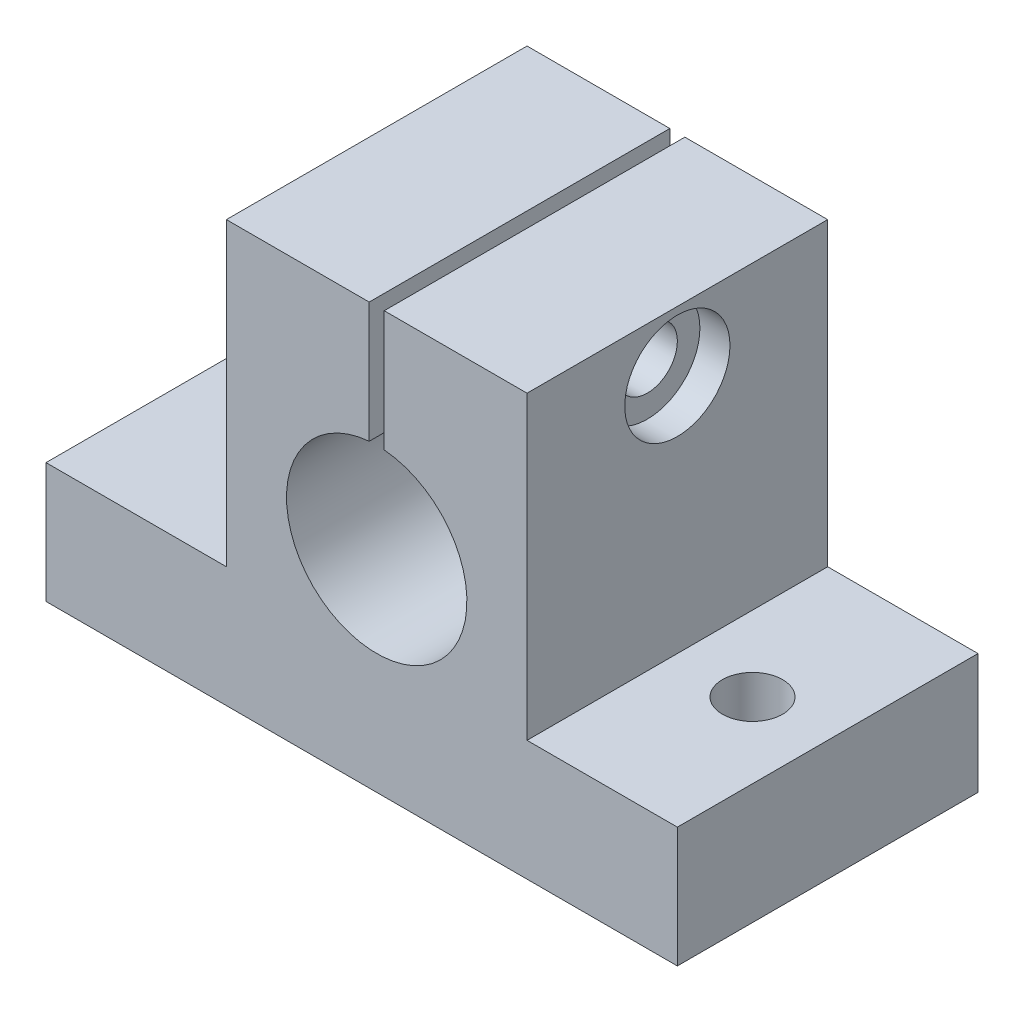
ISO-10303-21;
HEADER;
FILE_DESCRIPTION(('STEP AP214'),'2;1');
FILE_NAME('part.step','',(''),(''),'','','');
FILE_SCHEMA(('AUTOMOTIVE_DESIGN { 1 0 10303 214 1 1 1 1 }'));
ENDSEC;
DATA;
#1=APPLICATION_CONTEXT('core data for automotive mechanical design processes');
#2=APPLICATION_PROTOCOL_DEFINITION('international standard','automotive_design',2000,#1);
#3=PRODUCT_CONTEXT('',#1,'mechanical');
#4=PRODUCT('Part','Part','',(#3));
#5=PRODUCT_RELATED_PRODUCT_CATEGORY('part','',(#4));
#6=PRODUCT_DEFINITION_FORMATION('','',#4);
#7=PRODUCT_DEFINITION_CONTEXT('part definition',#1,'design');
#8=PRODUCT_DEFINITION('design','',#6,#7);
#9=PRODUCT_DEFINITION_SHAPE('','',#8);
#10=(LENGTH_UNIT() NAMED_UNIT(*) SI_UNIT(.MILLI.,.METRE.));
#11=(NAMED_UNIT(*) PLANE_ANGLE_UNIT() SI_UNIT($,.RADIAN.));
#12=(NAMED_UNIT(*) SI_UNIT($,.STERADIAN.) SOLID_ANGLE_UNIT());
#13=UNCERTAINTY_MEASURE_WITH_UNIT(LENGTH_MEASURE(1.E-05),#10,'distance_accuracy_value','');
#14=(GEOMETRIC_REPRESENTATION_CONTEXT(3) GLOBAL_UNCERTAINTY_ASSIGNED_CONTEXT((#13)) GLOBAL_UNIT_ASSIGNED_CONTEXT((#10,
#11,#12)) REPRESENTATION_CONTEXT('',''));
#15=CARTESIAN_POINT('',(0.,0.,0.));
#16=DIRECTION('',(0.,0.,1.));
#17=DIRECTION('',(1.,0.,0.));
#18=AXIS2_PLACEMENT_3D('',#15,#16,#17);
#19=CARTESIAN_POINT('',(-15.6568542494924,24.,10.));
#20=DIRECTION('',(1.,0.,0.));
#21=DIRECTION('',(0.,0.,-1.));
#22=AXIS2_PLACEMENT_3D('',#19,#20,#21);
#23=CYLINDRICAL_SURFACE('',#22,2.);
#24=CARTESIAN_POINT('',(-0.500000000000002,24.,10.));
#25=DIRECTION('',(-1.,0.,0.));
#26=DIRECTION('',(0.,-1.,0.));
#27=AXIS2_PLACEMENT_3D('',#24,#25,#26);
#28=CIRCLE('',#27,2.);
#29=CARTESIAN_POINT('',(-0.500000000000002,24.,8.));
#30=VERTEX_POINT('',#29);
#31=EDGE_CURVE('E219',#30,#30,#28,.T.);
#32=CARTESIAN_POINT('',(-7.,24.,10.));
#33=DIRECTION('',(-1.,0.,0.));
#34=DIRECTION('',(0.,0.,1.));
#35=AXIS2_PLACEMENT_3D('',#32,#33,#34);
#36=CIRCLE('',#35,2.);
#37=CARTESIAN_POINT('',(-7.,24.,8.));
#38=VERTEX_POINT('',#37);
#39=EDGE_CURVE('E39',#38,#38,#36,.F.);
#40=CARTESIAN_POINT('',(-0.500000000000002,24.,8.));
#41=CARTESIAN_POINT('',(-0.567708333333336,24.,8.));
#42=CARTESIAN_POINT('',(-0.635416666666669,24.,8.));
#43=CARTESIAN_POINT('',(-0.770833333333336,24.,8.));
#44=CARTESIAN_POINT('',(-0.838541666666669,24.,8.));
#45=CARTESIAN_POINT('',(-0.973958333333335,24.,8.));
#46=CARTESIAN_POINT('',(-1.04166666666667,24.,8.));
#47=CARTESIAN_POINT('',(-1.17708333333333,24.,8.));
#48=CARTESIAN_POINT('',(-1.24479166666667,24.,8.));
#49=CARTESIAN_POINT('',(-1.38020833333333,24.,8.));
#50=CARTESIAN_POINT('',(-1.44791666666667,24.,8.));
#51=CARTESIAN_POINT('',(-1.58333333333333,24.,8.));
#52=CARTESIAN_POINT('',(-1.65104166666667,24.,8.));
#53=CARTESIAN_POINT('',(-1.78645833333334,24.,8.));
#54=CARTESIAN_POINT('',(-1.85416666666667,24.,8.));
#55=CARTESIAN_POINT('',(-1.98958333333333,24.,8.));
#56=CARTESIAN_POINT('',(-2.05729166666667,24.,8.));
#57=CARTESIAN_POINT('',(-2.19270833333333,24.,8.));
#58=CARTESIAN_POINT('',(-2.26041666666667,24.,8.));
#59=CARTESIAN_POINT('',(-2.39583333333333,24.,8.));
#60=CARTESIAN_POINT('',(-2.46354166666667,24.,8.));
#61=CARTESIAN_POINT('',(-2.59895833333333,24.,8.));
#62=CARTESIAN_POINT('',(-2.66666666666667,24.,8.));
#63=CARTESIAN_POINT('',(-2.80208333333333,24.,8.));
#64=CARTESIAN_POINT('',(-2.86979166666667,24.,8.));
#65=CARTESIAN_POINT('',(-3.00520833333333,24.,8.));
#66=CARTESIAN_POINT('',(-3.07291666666667,24.,8.));
#67=CARTESIAN_POINT('',(-3.20833333333333,24.,8.));
#68=CARTESIAN_POINT('',(-3.27604166666667,24.,8.));
#69=CARTESIAN_POINT('',(-3.41145833333333,24.,8.));
#70=CARTESIAN_POINT('',(-3.47916666666667,24.,8.));
#71=CARTESIAN_POINT('',(-3.61458333333333,24.,8.));
#72=CARTESIAN_POINT('',(-3.68229166666667,24.,8.));
#73=CARTESIAN_POINT('',(-3.81770833333333,24.,8.));
#74=CARTESIAN_POINT('',(-3.88541666666667,24.,8.));
#75=CARTESIAN_POINT('',(-4.02083333333333,24.,8.));
#76=CARTESIAN_POINT('',(-4.08854166666667,24.,8.));
#77=CARTESIAN_POINT('',(-4.22395833333333,24.,8.));
#78=CARTESIAN_POINT('',(-4.29166666666667,24.,8.));
#79=CARTESIAN_POINT('',(-4.42708333333333,24.,8.));
#80=CARTESIAN_POINT('',(-4.49479166666667,24.,8.));
#81=CARTESIAN_POINT('',(-4.63020833333333,24.,8.));
#82=CARTESIAN_POINT('',(-4.69791666666667,24.,8.));
#83=CARTESIAN_POINT('',(-4.83333333333333,24.,8.));
#84=CARTESIAN_POINT('',(-4.90104166666667,24.,8.));
#85=CARTESIAN_POINT('',(-5.03645833333333,24.,8.));
#86=CARTESIAN_POINT('',(-5.10416666666667,24.,8.));
#87=CARTESIAN_POINT('',(-5.23958333333333,24.,8.));
#88=CARTESIAN_POINT('',(-5.30729166666667,24.,8.));
#89=CARTESIAN_POINT('',(-5.44270833333333,24.,8.));
#90=CARTESIAN_POINT('',(-5.51041666666667,24.,8.));
#91=CARTESIAN_POINT('',(-5.64583333333333,24.,8.));
#92=CARTESIAN_POINT('',(-5.71354166666666,24.,8.));
#93=CARTESIAN_POINT('',(-5.84895833333333,24.,8.));
#94=CARTESIAN_POINT('',(-5.91666666666666,24.,8.));
#95=CARTESIAN_POINT('',(-6.05208333333333,24.,8.));
#96=CARTESIAN_POINT('',(-6.11979166666667,24.,8.));
#97=CARTESIAN_POINT('',(-6.25520833333333,24.,8.));
#98=CARTESIAN_POINT('',(-6.32291666666667,24.,8.));
#99=CARTESIAN_POINT('',(-6.45833333333333,24.,8.));
#100=CARTESIAN_POINT('',(-6.52604166666666,24.,8.));
#101=CARTESIAN_POINT('',(-6.66145833333333,24.,8.));
#102=CARTESIAN_POINT('',(-6.72916666666666,24.,8.));
#103=CARTESIAN_POINT('',(-6.86458333333333,24.,8.));
#104=CARTESIAN_POINT('',(-6.93229166666666,24.,8.));
#105=CARTESIAN_POINT('',(-7.,24.,8.));
#106=B_SPLINE_CURVE_WITH_KNOTS('',3,(#40,#41,#42,#43,#44,#45,#46,#47,#48,#49,#50,#51,#52,#53,
#54,#55,#56,#57,#58,#59,#60,#61,#62,#63,#64,#65,#66,#67,#68,#69,#70,#71,#72,#73,#74,#75,#76,#77,
#78,#79,#80,#81,#82,#83,#84,#85,#86,#87,#88,#89,#90,#91,#92,#93,#94,#95,#96,#97,#98,#99,#100,
#101,#102,#103,#104,#105),.UNSPECIFIED.,.F.,.F.,(4,2,2,2,2,2,2,2,2,2,2,2,2,2,2,2,2,2,2,2,2,2,2,
2,2,2,2,2,2,2,2,2,4),(0.,0.203125,0.40625,0.609374999999999,0.812499999999999,1.015625,1.21875,
1.421875,1.625,1.828125,2.03125,2.234375,2.4375,2.640625,2.84375,3.046875,3.25,3.453125,3.65625,
3.859375,4.0625,4.265625,4.46875,4.671875,4.875,5.078125,5.28125,5.484375,5.6875,5.890625,
6.09374999999999,6.296875,6.5),.UNSPECIFIED.);
#107=EDGE_CURVE('BSEAM35',#30,#38,#106,.T.);
#108=ORIENTED_EDGE('',*,*,#31,.F.);
#109=ORIENTED_EDGE('',*,*,#39,.F.);
#110=ORIENTED_EDGE('',*,*,#107,.T.);
#111=ORIENTED_EDGE('',*,*,#107,.F.);
#112=EDGE_LOOP('',(#108,#110,#109,#111));
#113=FACE_BOUND('',#112,.T.);
#114=ADVANCED_FACE('F35',(#113),#23,.F.);
#115=CARTESIAN_POINT('',(0.5,24.,10.));
#116=DIRECTION('',(1.,0.,0.));
#117=DIRECTION('',(0.,1.,0.));
#118=AXIS2_PLACEMENT_3D('',#115,#116,#117);
#119=CIRCLE('',#118,2.);
#120=CARTESIAN_POINT('',(0.499999999999997,24.,8.));
#121=VERTEX_POINT('',#120);
#122=EDGE_CURVE('E224',#121,#121,#119,.T.);
#123=CARTESIAN_POINT('',(8.,24.,10.));
#124=DIRECTION('',(1.,0.,0.));
#125=DIRECTION('',(0.,0.,-1.));
#126=AXIS2_PLACEMENT_3D('',#123,#124,#125);
#127=CIRCLE('',#126,2.);
#128=CARTESIAN_POINT('',(8.,24.,8.));
#129=VERTEX_POINT('',#128);
#130=EDGE_CURVE('E217',#129,#129,#127,.F.);
#131=CARTESIAN_POINT('',(0.499999999999997,24.,8.));
#132=CARTESIAN_POINT('',(0.578124999999996,24.,8.));
#133=CARTESIAN_POINT('',(0.656249999999996,24.,8.));
#134=CARTESIAN_POINT('',(0.812499999999996,24.,8.));
#135=CARTESIAN_POINT('',(0.890624999999997,24.,8.));
#136=CARTESIAN_POINT('',(1.046875,24.,8.));
#137=CARTESIAN_POINT('',(1.125,24.,8.));
#138=CARTESIAN_POINT('',(1.28125,24.,8.));
#139=CARTESIAN_POINT('',(1.359375,24.,8.));
#140=CARTESIAN_POINT('',(1.515625,24.,8.));
#141=CARTESIAN_POINT('',(1.59375,24.,8.));
#142=CARTESIAN_POINT('',(1.75,24.,8.));
#143=CARTESIAN_POINT('',(1.828125,24.,8.));
#144=CARTESIAN_POINT('',(1.984375,24.,8.));
#145=CARTESIAN_POINT('',(2.0625,24.,8.));
#146=CARTESIAN_POINT('',(2.21875,24.,8.));
#147=CARTESIAN_POINT('',(2.296875,24.,8.));
#148=CARTESIAN_POINT('',(2.453125,24.,8.));
#149=CARTESIAN_POINT('',(2.53125,24.,8.));
#150=CARTESIAN_POINT('',(2.6875,24.,8.));
#151=CARTESIAN_POINT('',(2.765625,24.,8.));
#152=CARTESIAN_POINT('',(2.921875,24.,8.));
#153=CARTESIAN_POINT('',(3.,24.,8.));
#154=CARTESIAN_POINT('',(3.15625,24.,8.));
#155=CARTESIAN_POINT('',(3.234375,24.,8.));
#156=CARTESIAN_POINT('',(3.390625,24.,8.));
#157=CARTESIAN_POINT('',(3.46875,24.,8.));
#158=CARTESIAN_POINT('',(3.625,24.,8.));
#159=CARTESIAN_POINT('',(3.703125,24.,8.));
#160=CARTESIAN_POINT('',(3.859375,24.,8.));
#161=CARTESIAN_POINT('',(3.9375,24.,8.));
#162=CARTESIAN_POINT('',(4.09375,24.,8.));
#163=CARTESIAN_POINT('',(4.171875,24.,8.));
#164=CARTESIAN_POINT('',(4.328125,24.,8.));
#165=CARTESIAN_POINT('',(4.40625,24.,8.));
#166=CARTESIAN_POINT('',(4.5625,24.,8.));
#167=CARTESIAN_POINT('',(4.640625,24.,8.));
#168=CARTESIAN_POINT('',(4.796875,24.,8.));
#169=CARTESIAN_POINT('',(4.875,24.,8.));
#170=CARTESIAN_POINT('',(5.03125,24.,8.));
#171=CARTESIAN_POINT('',(5.109375,24.,8.));
#172=CARTESIAN_POINT('',(5.265625,24.,8.));
#173=CARTESIAN_POINT('',(5.34375,24.,8.));
#174=CARTESIAN_POINT('',(5.5,24.,8.));
#175=CARTESIAN_POINT('',(5.578125,24.,8.));
#176=CARTESIAN_POINT('',(5.734375,24.,8.));
#177=CARTESIAN_POINT('',(5.8125,24.,8.));
#178=CARTESIAN_POINT('',(5.96875,24.,8.));
#179=CARTESIAN_POINT('',(6.046875,24.,8.));
#180=CARTESIAN_POINT('',(6.203125,24.,8.));
#181=CARTESIAN_POINT('',(6.28125,24.,8.));
#182=CARTESIAN_POINT('',(6.4375,24.,8.));
#183=CARTESIAN_POINT('',(6.515625,24.,8.));
#184=CARTESIAN_POINT('',(6.671875,24.,8.));
#185=CARTESIAN_POINT('',(6.75,24.,8.));
#186=CARTESIAN_POINT('',(6.90625,24.,8.));
#187=CARTESIAN_POINT('',(6.984375,24.,8.));
#188=CARTESIAN_POINT('',(7.140625,24.,8.));
#189=CARTESIAN_POINT('',(7.21875,24.,8.));
#190=CARTESIAN_POINT('',(7.375,24.,8.));
#191=CARTESIAN_POINT('',(7.453125,24.,8.));
#192=CARTESIAN_POINT('',(7.609375,24.,8.));
#193=CARTESIAN_POINT('',(7.6875,24.,8.));
#194=CARTESIAN_POINT('',(7.84374999999999,24.,8.));
#195=CARTESIAN_POINT('',(7.921875,24.,8.));
#196=CARTESIAN_POINT('',(8.,24.,8.));
#197=B_SPLINE_CURVE_WITH_KNOTS('',3,(#131,#132,#133,#134,#135,#136,#137,#138,#139,#140,#141,
#142,#143,#144,#145,#146,#147,#148,#149,#150,#151,#152,#153,#154,#155,#156,#157,#158,#159,#160,
#161,#162,#163,#164,#165,#166,#167,#168,#169,#170,#171,#172,#173,#174,#175,#176,#177,#178,#179,
#180,#181,#182,#183,#184,#185,#186,#187,#188,#189,#190,#191,#192,#193,#194,#195,#196),
.UNSPECIFIED.,.F.,.F.,(4,2,2,2,2,2,2,2,2,2,2,2,2,2,2,2,2,2,2,2,2,2,2,2,2,2,2,2,2,2,2,2,4),(0.,
0.234374999999998,0.46875,0.703124999999999,0.937500000000001,1.171875,1.40625,1.640625,1.875,
2.109375,2.34375,2.578125,2.8125,3.046875,3.28125,3.515625,3.75,3.984375,4.21875,4.453125,
4.6875,4.921875,5.15625,5.390625,5.625,5.859375,6.09375,6.328125,6.5625,6.796875,7.03125,
7.265625,7.5),.UNSPECIFIED.);
#198=EDGE_CURVE('BSEAM314',#121,#129,#197,.T.);
#199=ORIENTED_EDGE('',*,*,#122,.F.);
#200=ORIENTED_EDGE('',*,*,#130,.F.);
#201=ORIENTED_EDGE('',*,*,#198,.T.);
#202=ORIENTED_EDGE('',*,*,#198,.F.);
#203=EDGE_LOOP('',(#199,#201,#200,#202));
#204=FACE_BOUND('',#203,.T.);
#205=ADVANCED_FACE('F314',(#204),#23,.F.);
#206=CARTESIAN_POINT('',(-22.,8.,20.));
#207=DIRECTION('',(1.,0.,0.));
#208=DIRECTION('',(0.,0.,-1.));
#209=AXIS2_PLACEMENT_3D('',#206,#207,#208);
#210=PLANE('',#209);
#211=DIRECTION('',(0.,-1.,0.));
#212=VECTOR('',#211,1.);
#213=CARTESIAN_POINT('',(-22.,8.,0.));
#214=LINE('',#213,#212);
#215=CARTESIAN_POINT('',(-22.,8.,0.));
#216=VERTEX_POINT('',#215);
#217=CARTESIAN_POINT('',(-22.,0.,0.));
#218=VERTEX_POINT('',#217);
#219=EDGE_CURVE('E170',#216,#218,#214,.T.);
#220=ORIENTED_EDGE('',*,*,#219,.T.);
#221=DIRECTION('',(0.,0.,-1.));
#222=VECTOR('',#221,1.);
#223=CARTESIAN_POINT('',(-22.,0.,20.));
#224=LINE('',#223,#222);
#225=CARTESIAN_POINT('',(-22.,0.,20.));
#226=VERTEX_POINT('',#225);
#227=EDGE_CURVE('E11',#226,#218,#224,.T.);
#228=ORIENTED_EDGE('',*,*,#227,.F.);
#229=DIRECTION('',(0.,-1.,0.));
#230=VECTOR('',#229,1.);
#231=CARTESIAN_POINT('',(-22.,8.,20.));
#232=LINE('',#231,#230);
#233=CARTESIAN_POINT('',(-22.,8.,20.));
#234=VERTEX_POINT('',#233);
#235=EDGE_CURVE('E194',#234,#226,#232,.T.);
#236=ORIENTED_EDGE('',*,*,#235,.F.);
#237=DIRECTION('',(0.,0.,-1.));
#238=VECTOR('',#237,1.);
#239=CARTESIAN_POINT('',(-22.,8.,20.));
#240=LINE('',#239,#238);
#241=EDGE_CURVE('E166',#234,#216,#240,.T.);
#242=ORIENTED_EDGE('',*,*,#241,.T.);
#243=EDGE_LOOP('',(#220,#228,#236,#242));
#244=FACE_BOUND('',#243,.T.);
#245=ADVANCED_FACE('F37',(#244),#210,.F.);
#246=CARTESIAN_POINT('',(-22.,0.,20.));
#247=DIRECTION('',(0.,1.,0.));
#248=DIRECTION('',(-1.,0.,0.));
#249=AXIS2_PLACEMENT_3D('',#246,#247,#248);
#250=PLANE('',#249);
#251=CARTESIAN_POINT('',(-17.,0.,10.));
#252=DIRECTION('',(0.,1.,0.));
#253=DIRECTION('',(-1.,0.,0.));
#254=AXIS2_PLACEMENT_3D('',#251,#252,#253);
#255=CIRCLE('',#254,2.);
#256=CARTESIAN_POINT('',(-19.,0.,10.));
#257=VERTEX_POINT('',#256);
#258=EDGE_CURVE('E242',#257,#257,#255,.F.);
#259=ORIENTED_EDGE('',*,*,#258,.F.);
#260=EDGE_LOOP('',(#259));
#261=FACE_BOUND('',#260,.T.);
#262=CARTESIAN_POINT('',(15.,0.,10.));
#263=DIRECTION('',(0.,1.,0.));
#264=DIRECTION('',(-1.,0.,0.));
#265=AXIS2_PLACEMENT_3D('',#262,#263,#264);
#266=CIRCLE('',#265,2.);
#267=CARTESIAN_POINT('',(13.,0.,10.));
#268=VERTEX_POINT('',#267);
#269=EDGE_CURVE('E174',#268,#268,#266,.F.);
#270=ORIENTED_EDGE('',*,*,#269,.F.);
#271=EDGE_LOOP('',(#270));
#272=FACE_BOUND('',#271,.T.);
#273=DIRECTION('',(1.,0.,0.));
#274=VECTOR('',#273,1.);
#275=CARTESIAN_POINT('',(-22.,0.,0.));
#276=LINE('',#275,#274);
#277=CARTESIAN_POINT('',(20.,0.,0.));
#278=VERTEX_POINT('',#277);
#279=EDGE_CURVE('E173',#218,#278,#276,.T.);
#280=ORIENTED_EDGE('',*,*,#279,.T.);
#281=DIRECTION('',(0.,0.,-1.));
#282=VECTOR('',#281,1.);
#283=CARTESIAN_POINT('',(20.,0.,20.));
#284=LINE('',#283,#282);
#285=CARTESIAN_POINT('',(20.,0.,20.));
#286=VERTEX_POINT('',#285);
#287=EDGE_CURVE('E44',#286,#278,#284,.T.);
#288=ORIENTED_EDGE('',*,*,#287,.F.);
#289=DIRECTION('',(1.,0.,0.));
#290=VECTOR('',#289,1.);
#291=CARTESIAN_POINT('',(-22.,0.,20.));
#292=LINE('',#291,#290);
#293=EDGE_CURVE('E114',#226,#286,#292,.T.);
#294=ORIENTED_EDGE('',*,*,#293,.F.);
#295=ORIENTED_EDGE('',*,*,#227,.T.);
#296=EDGE_LOOP('',(#280,#288,#294,#295));
#297=FACE_BOUND('',#296,.T.);
#298=ADVANCED_FACE('F282',(#261,#272,#297),#250,.F.);
#299=CARTESIAN_POINT('',(20.,0.,20.));
#300=DIRECTION('',(-1.,0.,0.));
#301=DIRECTION('',(0.,0.,1.));
#302=AXIS2_PLACEMENT_3D('',#299,#300,#301);
#303=PLANE('',#302);
#304=DIRECTION('',(0.,1.,0.));
#305=VECTOR('',#304,1.);
#306=CARTESIAN_POINT('',(20.,0.,0.));
#307=LINE('',#306,#305);
#308=CARTESIAN_POINT('',(20.,8.00000000000001,0.));
#309=VERTEX_POINT('',#308);
#310=EDGE_CURVE('E176',#278,#309,#307,.T.);
#311=ORIENTED_EDGE('',*,*,#310,.T.);
#312=DIRECTION('',(0.,0.,-1.));
#313=VECTOR('',#312,1.);
#314=CARTESIAN_POINT('',(20.,8.00000000000001,20.));
#315=LINE('',#314,#313);
#316=CARTESIAN_POINT('',(20.,8.00000000000001,20.));
#317=VERTEX_POINT('',#316);
#318=EDGE_CURVE('E213',#317,#309,#315,.T.);
#319=ORIENTED_EDGE('',*,*,#318,.F.);
#320=DIRECTION('',(0.,1.,0.));
#321=VECTOR('',#320,1.);
#322=CARTESIAN_POINT('',(20.,0.,20.));
#323=LINE('',#322,#321);
#324=EDGE_CURVE('E252',#286,#317,#323,.T.);
#325=ORIENTED_EDGE('',*,*,#324,.F.);
#326=ORIENTED_EDGE('',*,*,#287,.T.);
#327=EDGE_LOOP('',(#311,#319,#325,#326));
#328=FACE_BOUND('',#327,.T.);
#329=ADVANCED_FACE('F285',(#328),#303,.F.);
#330=CARTESIAN_POINT('',(20.,8.00000000000001,20.));
#331=DIRECTION('',(0.,-1.,0.));
#332=DIRECTION('',(1.,0.,0.));
#333=AXIS2_PLACEMENT_3D('',#330,#331,#332);
#334=PLANE('',#333);
#335=CARTESIAN_POINT('',(15.,8.,10.));
#336=DIRECTION('',(0.,1.,0.));
#337=DIRECTION('',(-1.,0.,0.));
#338=AXIS2_PLACEMENT_3D('',#335,#336,#337);
#339=CIRCLE('',#338,2.);
#340=CARTESIAN_POINT('',(13.,8.,10.));
#341=VERTEX_POINT('',#340);
#342=EDGE_CURVE('E245',#341,#341,#339,.T.);
#343=ORIENTED_EDGE('',*,*,#342,.F.);
#344=EDGE_LOOP('',(#343));
#345=FACE_BOUND('',#344,.T.);
#346=DIRECTION('',(-1.,0.,0.));
#347=VECTOR('',#346,1.);
#348=CARTESIAN_POINT('',(20.,8.00000000000001,0.));
#349=LINE('',#348,#347);
#350=CARTESIAN_POINT('',(10.,8.,0.));
#351=VERTEX_POINT('',#350);
#352=EDGE_CURVE('E178',#309,#351,#349,.T.);
#353=ORIENTED_EDGE('',*,*,#352,.T.);
#354=DIRECTION('',(0.,0.,-1.));
#355=VECTOR('',#354,1.);
#356=CARTESIAN_POINT('',(10.,8.,20.));
#357=LINE('',#356,#355);
#358=CARTESIAN_POINT('',(10.,8.,20.));
#359=VERTEX_POINT('',#358);
#360=EDGE_CURVE('E210',#359,#351,#357,.T.);
#361=ORIENTED_EDGE('',*,*,#360,.F.);
#362=DIRECTION('',(-1.,0.,0.));
#363=VECTOR('',#362,1.);
#364=CARTESIAN_POINT('',(20.,8.00000000000001,20.));
#365=LINE('',#364,#363);
#366=EDGE_CURVE('E254',#317,#359,#365,.T.);
#367=ORIENTED_EDGE('',*,*,#366,.F.);
#368=ORIENTED_EDGE('',*,*,#318,.T.);
#369=EDGE_LOOP('',(#353,#361,#367,#368));
#370=FACE_BOUND('',#369,.T.);
#371=ADVANCED_FACE('F290',(#345,#370),#334,.F.);
#372=CARTESIAN_POINT('',(10.,8.,20.));
#373=DIRECTION('',(-1.,0.,0.));
#374=DIRECTION('',(0.,0.,1.));
#375=AXIS2_PLACEMENT_3D('',#372,#373,#374);
#376=PLANE('',#375);
#377=CARTESIAN_POINT('',(10.,24.,10.));
#378=DIRECTION('',(1.,0.,0.));
#379=DIRECTION('',(0.,0.,-1.));
#380=AXIS2_PLACEMENT_3D('',#377,#378,#379);
#381=CIRCLE('',#380,3.5);
#382=CARTESIAN_POINT('',(10.,24.,6.5));
#383=VERTEX_POINT('',#382);
#384=EDGE_CURVE('E227',#383,#383,#381,.T.);
#385=ORIENTED_EDGE('',*,*,#384,.F.);
#386=EDGE_LOOP('',(#385));
#387=FACE_BOUND('',#386,.T.);
#388=DIRECTION('',(0.,1.,0.));
#389=VECTOR('',#388,1.);
#390=CARTESIAN_POINT('',(10.,8.,0.));
#391=LINE('',#390,#389);
#392=CARTESIAN_POINT('',(10.,28.,0.));
#393=VERTEX_POINT('',#392);
#394=EDGE_CURVE('E180',#351,#393,#391,.T.);
#395=ORIENTED_EDGE('',*,*,#394,.T.);
#396=DIRECTION('',(0.,0.,-1.));
#397=VECTOR('',#396,1.);
#398=CARTESIAN_POINT('',(10.,28.,20.));
#399=LINE('',#398,#397);
#400=CARTESIAN_POINT('',(10.,28.,20.));
#401=VERTEX_POINT('',#400);
#402=EDGE_CURVE('E207',#401,#393,#399,.T.);
#403=ORIENTED_EDGE('',*,*,#402,.F.);
#404=DIRECTION('',(0.,1.,0.));
#405=VECTOR('',#404,1.);
#406=CARTESIAN_POINT('',(10.,8.,20.));
#407=LINE('',#406,#405);
#408=EDGE_CURVE('E256',#359,#401,#407,.T.);
#409=ORIENTED_EDGE('',*,*,#408,.F.);
#410=ORIENTED_EDGE('',*,*,#360,.T.);
#411=EDGE_LOOP('',(#395,#403,#409,#410));
#412=FACE_BOUND('',#411,.T.);
#413=ADVANCED_FACE('F296',(#387,#412),#376,.F.);
#414=CARTESIAN_POINT('',(10.,28.,20.));
#415=DIRECTION('',(0.,-1.,0.));
#416=DIRECTION('',(0.,0.,-1.));
#417=AXIS2_PLACEMENT_3D('',#414,#415,#416);
#418=PLANE('',#417);
#419=DIRECTION('',(-1.,0.,0.));
#420=VECTOR('',#419,1.);
#421=CARTESIAN_POINT('',(10.,28.,0.));
#422=LINE('',#421,#420);
#423=CARTESIAN_POINT('',(0.5,28.,0.));
#424=VERTEX_POINT('',#423);
#425=EDGE_CURVE('E182',#393,#424,#422,.T.);
#426=ORIENTED_EDGE('',*,*,#425,.T.);
#427=DIRECTION('',(0.,0.,-1.));
#428=VECTOR('',#427,1.);
#429=CARTESIAN_POINT('',(0.5,28.,20.));
#430=LINE('',#429,#428);
#431=CARTESIAN_POINT('',(0.5,28.,20.));
#432=VERTEX_POINT('',#431);
#433=EDGE_CURVE('E204',#432,#424,#430,.T.);
#434=ORIENTED_EDGE('',*,*,#433,.F.);
#435=DIRECTION('',(-1.,0.,0.));
#436=VECTOR('',#435,1.);
#437=CARTESIAN_POINT('',(10.,28.,20.));
#438=LINE('',#437,#436);
#439=EDGE_CURVE('E258',#401,#432,#438,.T.);
#440=ORIENTED_EDGE('',*,*,#439,.F.);
#441=ORIENTED_EDGE('',*,*,#402,.T.);
#442=EDGE_LOOP('',(#426,#434,#440,#441));
#443=FACE_BOUND('',#442,.T.);
#444=ADVANCED_FACE('F300',(#443),#418,.F.);
#445=CARTESIAN_POINT('',(0.5,28.,20.));
#446=DIRECTION('',(1.,0.,0.));
#447=DIRECTION('',(0.,1.,0.));
#448=AXIS2_PLACEMENT_3D('',#445,#446,#447);
#449=PLANE('',#448);
#450=ORIENTED_EDGE('',*,*,#122,.T.);
#451=EDGE_LOOP('',(#450));
#452=FACE_BOUND('',#451,.T.);
#453=DIRECTION('',(0.,-1.,0.));
#454=VECTOR('',#453,1.);
#455=CARTESIAN_POINT('',(0.5,28.,0.));
#456=LINE('',#455,#454);
#457=CARTESIAN_POINT('',(0.500000000000001,19.9791303715507,0.));
#458=VERTEX_POINT('',#457);
#459=EDGE_CURVE('E184',#424,#458,#456,.T.);
#460=ORIENTED_EDGE('',*,*,#459,.T.);
#461=DIRECTION('',(0.,0.,-1.));
#462=VECTOR('',#461,1.);
#463=CARTESIAN_POINT('',(0.500000000000001,19.9791303715507,20.));
#464=LINE('',#463,#462);
#465=CARTESIAN_POINT('',(0.500000000000001,19.9791303715507,20.));
#466=VERTEX_POINT('',#465);
#467=EDGE_CURVE('E201',#466,#458,#464,.T.);
#468=ORIENTED_EDGE('',*,*,#467,.F.);
#469=DIRECTION('',(0.,-1.,0.));
#470=VECTOR('',#469,1.);
#471=CARTESIAN_POINT('',(0.5,28.,20.));
#472=LINE('',#471,#470);
#473=EDGE_CURVE('E260',#432,#466,#472,.T.);
#474=ORIENTED_EDGE('',*,*,#473,.F.);
#475=ORIENTED_EDGE('',*,*,#433,.T.);
#476=EDGE_LOOP('',(#460,#468,#474,#475));
#477=FACE_BOUND('',#476,.T.);
#478=ADVANCED_FACE('F303',(#452,#477),#449,.F.);
#479=CARTESIAN_POINT('',(0.,14.,20.));
#480=DIRECTION('',(0.,0.,-1.));
#481=DIRECTION('',(-1.,0.,0.));
#482=AXIS2_PLACEMENT_3D('',#479,#480,#481);
#483=CYLINDRICAL_SURFACE('',#482,6.);
#484=CARTESIAN_POINT('',(0.,14.,0.));
#485=DIRECTION('',(0.,0.,-1.));
#486=DIRECTION('',(1.,0.,0.));
#487=AXIS2_PLACEMENT_3D('',#484,#485,#486);
#488=CIRCLE('',#487,6.);
#489=CARTESIAN_POINT('',(-0.500000000000001,19.9791303715507,0.));
#490=VERTEX_POINT('',#489);
#491=EDGE_CURVE('E186',#458,#490,#488,.T.);
#492=ORIENTED_EDGE('',*,*,#491,.T.);
#493=DIRECTION('',(0.,0.,-1.));
#494=VECTOR('',#493,1.);
#495=CARTESIAN_POINT('',(-0.500000000000001,19.9791303715507,20.));
#496=LINE('',#495,#494);
#497=CARTESIAN_POINT('',(-0.500000000000001,19.9791303715507,20.));
#498=VERTEX_POINT('',#497);
#499=EDGE_CURVE('E198',#498,#490,#496,.T.);
#500=ORIENTED_EDGE('',*,*,#499,.F.);
#501=CARTESIAN_POINT('',(0.,14.,20.));
#502=DIRECTION('',(0.,0.,-1.));
#503=DIRECTION('',(1.,0.,0.));
#504=AXIS2_PLACEMENT_3D('',#501,#502,#503);
#505=CIRCLE('',#504,6.);
#506=EDGE_CURVE('E262',#466,#498,#505,.T.);
#507=ORIENTED_EDGE('',*,*,#506,.F.);
#508=ORIENTED_EDGE('',*,*,#467,.T.);
#509=EDGE_LOOP('',(#492,#500,#507,#508));
#510=FACE_BOUND('',#509,.T.);
#511=ADVANCED_FACE('F268',(#510),#483,.F.);
#512=CARTESIAN_POINT('',(-0.500000000000001,19.9791303715507,20.));
#513=DIRECTION('',(-1.,0.,0.));
#514=DIRECTION('',(0.,-1.,0.));
#515=AXIS2_PLACEMENT_3D('',#512,#513,#514);
#516=PLANE('',#515);
#517=ORIENTED_EDGE('',*,*,#31,.T.);
#518=EDGE_LOOP('',(#517));
#519=FACE_BOUND('',#518,.T.);
#520=DIRECTION('',(0.,1.,0.));
#521=VECTOR('',#520,1.);
#522=CARTESIAN_POINT('',(-0.500000000000001,19.9791303715507,0.));
#523=LINE('',#522,#521);
#524=CARTESIAN_POINT('',(-0.5,28.,0.));
#525=VERTEX_POINT('',#524);
#526=EDGE_CURVE('E188',#490,#525,#523,.T.);
#527=ORIENTED_EDGE('',*,*,#526,.T.);
#528=DIRECTION('',(0.,0.,-1.));
#529=VECTOR('',#528,1.);
#530=CARTESIAN_POINT('',(-0.5,28.,20.));
#531=LINE('',#530,#529);
#532=CARTESIAN_POINT('',(-0.5,28.,20.));
#533=VERTEX_POINT('',#532);
#534=EDGE_CURVE('E161',#533,#525,#531,.T.);
#535=ORIENTED_EDGE('',*,*,#534,.F.);
#536=DIRECTION('',(0.,1.,0.));
#537=VECTOR('',#536,1.);
#538=CARTESIAN_POINT('',(-0.500000000000001,19.9791303715507,20.));
#539=LINE('',#538,#537);
#540=EDGE_CURVE('E149',#498,#533,#539,.T.);
#541=ORIENTED_EDGE('',*,*,#540,.F.);
#542=ORIENTED_EDGE('',*,*,#499,.T.);
#543=EDGE_LOOP('',(#527,#535,#541,#542));
#544=FACE_BOUND('',#543,.T.);
#545=ADVANCED_FACE('F272',(#519,#544),#516,.F.);
#546=CARTESIAN_POINT('',(-0.5,28.,20.));
#547=DIRECTION('',(0.,-1.,0.));
#548=DIRECTION('',(0.,0.,-1.));
#549=AXIS2_PLACEMENT_3D('',#546,#547,#548);
#550=PLANE('',#549);
#551=DIRECTION('',(-1.,0.,0.));
#552=VECTOR('',#551,1.);
#553=CARTESIAN_POINT('',(-0.5,28.,0.));
#554=LINE('',#553,#552);
#555=CARTESIAN_POINT('',(-10.,28.,0.));
#556=VERTEX_POINT('',#555);
#557=EDGE_CURVE('E158',#525,#556,#554,.T.);
#558=ORIENTED_EDGE('',*,*,#557,.T.);
#559=DIRECTION('',(0.,0.,-1.));
#560=VECTOR('',#559,1.);
#561=CARTESIAN_POINT('',(-10.,28.,20.));
#562=LINE('',#561,#560);
#563=CARTESIAN_POINT('',(-10.,28.,20.));
#564=VERTEX_POINT('',#563);
#565=EDGE_CURVE('E155',#564,#556,#562,.T.);
#566=ORIENTED_EDGE('',*,*,#565,.F.);
#567=DIRECTION('',(-1.,0.,0.));
#568=VECTOR('',#567,1.);
#569=CARTESIAN_POINT('',(-0.5,28.,20.));
#570=LINE('',#569,#568);
#571=EDGE_CURVE('E142',#533,#564,#570,.T.);
#572=ORIENTED_EDGE('',*,*,#571,.F.);
#573=ORIENTED_EDGE('',*,*,#534,.T.);
#574=EDGE_LOOP('',(#558,#566,#572,#573));
#575=FACE_BOUND('',#574,.T.);
#576=ADVANCED_FACE('F156',(#575),#550,.F.);
#577=CARTESIAN_POINT('',(-10.,28.,20.));
#578=DIRECTION('',(1.,0.,0.));
#579=DIRECTION('',(0.,0.,-1.));
#580=AXIS2_PLACEMENT_3D('',#577,#578,#579);
#581=PLANE('',#580);
#582=DIRECTION('',(0.,0.866025403784439,-0.5));
#583=VECTOR('',#582,1.);
#584=CARTESIAN_POINT('',(-10.,24.,14.0414518843274));
#585=LINE('',#584,#583);
#586=CARTESIAN_POINT('',(-10.,24.,14.0414518843274));
#587=VERTEX_POINT('',#586);
#588=CARTESIAN_POINT('',(-10.,27.5,12.0207259421637));
#589=VERTEX_POINT('',#588);
#590=EDGE_CURVE('E562',#587,#589,#585,.T.);
#591=ORIENTED_EDGE('',*,*,#590,.F.);
#592=DIRECTION('',(0.,0.866025403784439,0.5));
#593=VECTOR('',#592,1.);
#594=CARTESIAN_POINT('',(-10.,20.5,12.0207259421637));
#595=LINE('',#594,#593);
#596=CARTESIAN_POINT('',(-10.,20.5,12.0207259421637));
#597=VERTEX_POINT('',#596);
#598=EDGE_CURVE('E52',#597,#587,#595,.T.);
#599=ORIENTED_EDGE('',*,*,#598,.F.);
#600=DIRECTION('',(0.,0.,1.));
#601=VECTOR('',#600,1.);
#602=CARTESIAN_POINT('',(-10.,20.5,7.9792740578363));
#603=LINE('',#602,#601);
#604=CARTESIAN_POINT('',(-10.,20.5,7.9792740578363));
#605=VERTEX_POINT('',#604);
#606=EDGE_CURVE('E586',#605,#597,#603,.T.);
#607=ORIENTED_EDGE('',*,*,#606,.F.);
#608=DIRECTION('',(0.,-0.866025403784439,0.5));
#609=VECTOR('',#608,1.);
#610=CARTESIAN_POINT('',(-10.,24.,5.95854811567262));
#611=LINE('',#610,#609);
#612=CARTESIAN_POINT('',(-10.,24.,5.95854811567262));
#613=VERTEX_POINT('',#612);
#614=EDGE_CURVE('E580',#613,#605,#611,.T.);
#615=ORIENTED_EDGE('',*,*,#614,.F.);
#616=DIRECTION('',(0.,-0.866025403784439,-0.5));
#617=VECTOR('',#616,1.);
#618=CARTESIAN_POINT('',(-10.,27.5,7.97927405783631));
#619=LINE('',#618,#617);
#620=CARTESIAN_POINT('',(-10.,27.5,7.97927405783631));
#621=VERTEX_POINT('',#620);
#622=EDGE_CURVE('E577',#621,#613,#619,.T.);
#623=ORIENTED_EDGE('',*,*,#622,.F.);
#624=DIRECTION('',(0.,0.,-1.));
#625=VECTOR('',#624,1.);
#626=CARTESIAN_POINT('',(-10.,27.5,12.0207259421637));
#627=LINE('',#626,#625);
#628=EDGE_CURVE('E571',#589,#621,#627,.T.);
#629=ORIENTED_EDGE('',*,*,#628,.F.);
#630=EDGE_LOOP('',(#591,#599,#607,#615,#623,#629));
#631=FACE_BOUND('',#630,.T.);
#632=DIRECTION('',(0.,-1.,0.));
#633=VECTOR('',#632,1.);
#634=CARTESIAN_POINT('',(-10.,28.,0.));
#635=LINE('',#634,#633);
#636=CARTESIAN_POINT('',(-10.,8.,0.));
#637=VERTEX_POINT('',#636);
#638=EDGE_CURVE('E191',#556,#637,#635,.T.);
#639=ORIENTED_EDGE('',*,*,#638,.T.);
#640=DIRECTION('',(0.,0.,-1.));
#641=VECTOR('',#640,1.);
#642=CARTESIAN_POINT('',(-10.,8.,20.));
#643=LINE('',#642,#641);
#644=CARTESIAN_POINT('',(-10.,8.,20.));
#645=VERTEX_POINT('',#644);
#646=EDGE_CURVE('E162',#645,#637,#643,.T.);
#647=ORIENTED_EDGE('',*,*,#646,.F.);
#648=DIRECTION('',(0.,-1.,0.));
#649=VECTOR('',#648,1.);
#650=CARTESIAN_POINT('',(-10.,28.,20.));
#651=LINE('',#650,#649);
#652=EDGE_CURVE('E146',#564,#645,#651,.T.);
#653=ORIENTED_EDGE('',*,*,#652,.F.);
#654=ORIENTED_EDGE('',*,*,#565,.T.);
#655=EDGE_LOOP('',(#639,#647,#653,#654));
#656=FACE_BOUND('',#655,.T.);
#657=ADVANCED_FACE('F164',(#631,#656),#581,.F.);
#658=CARTESIAN_POINT('',(-10.,8.,20.));
#659=DIRECTION('',(0.,-1.,0.));
#660=DIRECTION('',(0.,0.,-1.));
#661=AXIS2_PLACEMENT_3D('',#658,#659,#660);
#662=PLANE('',#661);
#663=CARTESIAN_POINT('',(-17.,7.99999999999999,10.));
#664=DIRECTION('',(0.,1.,0.));
#665=DIRECTION('',(-1.,0.,0.));
#666=AXIS2_PLACEMENT_3D('',#663,#664,#665);
#667=CIRCLE('',#666,2.);
#668=CARTESIAN_POINT('',(-19.,7.99999999999998,10.));
#669=VERTEX_POINT('',#668);
#670=EDGE_CURVE('E239',#669,#669,#667,.T.);
#671=ORIENTED_EDGE('',*,*,#670,.F.);
#672=EDGE_LOOP('',(#671));
#673=FACE_BOUND('',#672,.T.);
#674=DIRECTION('',(-1.,0.,0.));
#675=VECTOR('',#674,1.);
#676=CARTESIAN_POINT('',(-10.,8.,0.));
#677=LINE('',#676,#675);
#678=EDGE_CURVE('E106',#637,#216,#677,.T.);
#679=ORIENTED_EDGE('',*,*,#678,.T.);
#680=ORIENTED_EDGE('',*,*,#241,.F.);
#681=DIRECTION('',(-1.,0.,0.));
#682=VECTOR('',#681,1.);
#683=CARTESIAN_POINT('',(-10.,8.,20.));
#684=LINE('',#683,#682);
#685=EDGE_CURVE('E61',#645,#234,#684,.T.);
#686=ORIENTED_EDGE('',*,*,#685,.F.);
#687=ORIENTED_EDGE('',*,*,#646,.T.);
#688=EDGE_LOOP('',(#679,#680,#686,#687));
#689=FACE_BOUND('',#688,.T.);
#690=ADVANCED_FACE('F276',(#673,#689),#662,.F.);
#691=CARTESIAN_POINT('',(0.,14.,20.));
#692=DIRECTION('',(0.,0.,1.));
#693=DIRECTION('',(1.,0.,0.));
#694=AXIS2_PLACEMENT_3D('',#691,#692,#693);
#695=PLANE('',#694);
#696=ORIENTED_EDGE('',*,*,#235,.T.);
#697=ORIENTED_EDGE('',*,*,#293,.T.);
#698=ORIENTED_EDGE('',*,*,#324,.T.);
#699=ORIENTED_EDGE('',*,*,#366,.T.);
#700=ORIENTED_EDGE('',*,*,#408,.T.);
#701=ORIENTED_EDGE('',*,*,#439,.T.);
#702=ORIENTED_EDGE('',*,*,#473,.T.);
#703=ORIENTED_EDGE('',*,*,#506,.T.);
#704=ORIENTED_EDGE('',*,*,#540,.T.);
#705=ORIENTED_EDGE('',*,*,#571,.T.);
#706=ORIENTED_EDGE('',*,*,#652,.T.);
#707=ORIENTED_EDGE('',*,*,#685,.T.);
#708=EDGE_LOOP('',(#696,#697,#698,#699,#700,#701,#702,#703,#704,#705,#706,#707));
#709=FACE_BOUND('',#708,.T.);
#710=ADVANCED_FACE('F144',(#709),#695,.T.);
#711=CARTESIAN_POINT('',(0.,14.,0.));
#712=DIRECTION('',(0.,0.,1.));
#713=DIRECTION('',(1.,0.,0.));
#714=AXIS2_PLACEMENT_3D('',#711,#712,#713);
#715=PLANE('',#714);
#716=ORIENTED_EDGE('',*,*,#219,.F.);
#717=ORIENTED_EDGE('',*,*,#678,.F.);
#718=ORIENTED_EDGE('',*,*,#638,.F.);
#719=ORIENTED_EDGE('',*,*,#557,.F.);
#720=ORIENTED_EDGE('',*,*,#526,.F.);
#721=ORIENTED_EDGE('',*,*,#491,.F.);
#722=ORIENTED_EDGE('',*,*,#459,.F.);
#723=ORIENTED_EDGE('',*,*,#425,.F.);
#724=ORIENTED_EDGE('',*,*,#394,.F.);
#725=ORIENTED_EDGE('',*,*,#352,.F.);
#726=ORIENTED_EDGE('',*,*,#310,.F.);
#727=ORIENTED_EDGE('',*,*,#279,.F.);
#728=EDGE_LOOP('',(#716,#717,#718,#719,#720,#721,#722,#723,#724,#725,#726,#727));
#729=FACE_BOUND('',#728,.T.);
#730=ADVANCED_FACE('F275',(#729),#715,.F.);
#731=CARTESIAN_POINT('',(15.,-5.65685424949239,10.));
#732=DIRECTION('',(0.,1.,0.));
#733=DIRECTION('',(-1.,0.,0.));
#734=AXIS2_PLACEMENT_3D('',#731,#732,#733);
#735=CYLINDRICAL_SURFACE('',#734,2.);
#736=ORIENTED_EDGE('',*,*,#269,.T.);
#737=EDGE_LOOP('',(#736));
#738=FACE_BOUND('',#737,.T.);
#739=ORIENTED_EDGE('',*,*,#342,.T.);
#740=EDGE_LOOP('',(#739));
#741=FACE_BOUND('',#740,.T.);
#742=ADVANCED_FACE('F331',(#738,#741),#735,.F.);
#743=CARTESIAN_POINT('',(-17.,-5.6568542494924,10.));
#744=DIRECTION('',(0.,1.,0.));
#745=DIRECTION('',(-1.,0.,0.));
#746=AXIS2_PLACEMENT_3D('',#743,#744,#745);
#747=CYLINDRICAL_SURFACE('',#746,2.);
#748=ORIENTED_EDGE('',*,*,#258,.T.);
#749=EDGE_LOOP('',(#748));
#750=FACE_BOUND('',#749,.T.);
#751=ORIENTED_EDGE('',*,*,#670,.T.);
#752=EDGE_LOOP('',(#751));
#753=FACE_BOUND('',#752,.T.);
#754=ADVANCED_FACE('F327',(#750,#753),#747,.F.);
#755=CARTESIAN_POINT('',(8.,24.,10.));
#756=DIRECTION('',(1.,0.,0.));
#757=DIRECTION('',(0.,0.,-1.));
#758=AXIS2_PLACEMENT_3D('',#755,#756,#757);
#759=PLANE('',#758);
#760=CARTESIAN_POINT('',(8.,24.,10.));
#761=DIRECTION('',(1.,0.,0.));
#762=DIRECTION('',(0.,0.,-1.));
#763=AXIS2_PLACEMENT_3D('',#760,#761,#762);
#764=CIRCLE('',#763,3.5);
#765=CARTESIAN_POINT('',(8.,24.,6.5));
#766=VERTEX_POINT('',#765);
#767=EDGE_CURVE('E220',#766,#766,#764,.T.);
#768=ORIENTED_EDGE('',*,*,#767,.T.);
#769=EDGE_LOOP('',(#768));
#770=FACE_BOUND('',#769,.T.);
#771=ORIENTED_EDGE('',*,*,#130,.T.);
#772=EDGE_LOOP('',(#771));
#773=FACE_BOUND('',#772,.T.);
#774=ADVANCED_FACE('F330',(#770,#773),#759,.T.);
#775=CARTESIAN_POINT('',(8.,24.,10.));
#776=DIRECTION('',(1.,0.,0.));
#777=DIRECTION('',(0.,0.,-1.));
#778=AXIS2_PLACEMENT_3D('',#775,#776,#777);
#779=CYLINDRICAL_SURFACE('',#778,3.5);
#780=ORIENTED_EDGE('',*,*,#767,.F.);
#781=EDGE_LOOP('',(#780));
#782=FACE_BOUND('',#781,.T.);
#783=ORIENTED_EDGE('',*,*,#384,.T.);
#784=EDGE_LOOP('',(#783));
#785=FACE_BOUND('',#784,.T.);
#786=ADVANCED_FACE('F325',(#782,#785),#779,.F.);
#787=CARTESIAN_POINT('',(-7.,0.,0.));
#788=DIRECTION('',(-1.,0.,0.));
#789=DIRECTION('',(0.,0.,1.));
#790=AXIS2_PLACEMENT_3D('',#787,#788,#789);
#791=PLANE('',#790);
#792=DIRECTION('',(0.,0.866025403784439,0.5));
#793=VECTOR('',#792,1.);
#794=CARTESIAN_POINT('',(-7.,20.5,12.0207259421637));
#795=LINE('',#794,#793);
#796=CARTESIAN_POINT('',(-7.,20.5,12.0207259421637));
#797=VERTEX_POINT('',#796);
#798=CARTESIAN_POINT('',(-7.,24.,14.0414518843274));
#799=VERTEX_POINT('',#798);
#800=EDGE_CURVE('E589',#797,#799,#795,.T.);
#801=ORIENTED_EDGE('',*,*,#800,.T.);
#802=DIRECTION('',(0.,0.866025403784439,-0.5));
#803=VECTOR('',#802,1.);
#804=CARTESIAN_POINT('',(-7.,24.,14.0414518843274));
#805=LINE('',#804,#803);
#806=CARTESIAN_POINT('',(-7.,27.5,12.0207259421637));
#807=VERTEX_POINT('',#806);
#808=EDGE_CURVE('E615',#799,#807,#805,.T.);
#809=ORIENTED_EDGE('',*,*,#808,.T.);
#810=DIRECTION('',(0.,0.,-1.));
#811=VECTOR('',#810,1.);
#812=CARTESIAN_POINT('',(-7.,27.5,12.0207259421637));
#813=LINE('',#812,#811);
#814=CARTESIAN_POINT('',(-7.,27.5,7.97927405783631));
#815=VERTEX_POINT('',#814);
#816=EDGE_CURVE('E612',#807,#815,#813,.T.);
#817=ORIENTED_EDGE('',*,*,#816,.T.);
#818=DIRECTION('',(0.,-0.866025403784439,-0.5));
#819=VECTOR('',#818,1.);
#820=CARTESIAN_POINT('',(-7.,27.5,7.97927405783631));
#821=LINE('',#820,#819);
#822=CARTESIAN_POINT('',(-7.,24.,5.95854811567262));
#823=VERTEX_POINT('',#822);
#824=EDGE_CURVE('E607',#815,#823,#821,.T.);
#825=ORIENTED_EDGE('',*,*,#824,.T.);
#826=DIRECTION('',(0.,-0.866025403784439,0.5));
#827=VECTOR('',#826,1.);
#828=CARTESIAN_POINT('',(-7.,24.,5.95854811567262));
#829=LINE('',#828,#827);
#830=CARTESIAN_POINT('',(-7.,20.5,7.9792740578363));
#831=VERTEX_POINT('',#830);
#832=EDGE_CURVE('E602',#823,#831,#829,.T.);
#833=ORIENTED_EDGE('',*,*,#832,.T.);
#834=DIRECTION('',(0.,0.,1.));
#835=VECTOR('',#834,1.);
#836=CARTESIAN_POINT('',(-7.,20.5,7.9792740578363));
#837=LINE('',#836,#835);
#838=EDGE_CURVE('E600',#831,#797,#837,.T.);
#839=ORIENTED_EDGE('',*,*,#838,.T.);
#840=EDGE_LOOP('',(#801,#809,#817,#825,#833,#839));
#841=FACE_BOUND('',#840,.T.);
#842=ORIENTED_EDGE('',*,*,#39,.T.);
#843=EDGE_LOOP('',(#842));
#844=FACE_BOUND('',#843,.T.);
#845=ADVANCED_FACE('F398',(#841,#844),#791,.T.);
#846=CARTESIAN_POINT('',(-7.,20.5,12.0207259421637));
#847=DIRECTION('',(0.,-0.5,0.866025403784439));
#848=DIRECTION('',(0.,-0.866025403784439,-0.5));
#849=AXIS2_PLACEMENT_3D('',#846,#847,#848);
#850=PLANE('',#849);
#851=ORIENTED_EDGE('',*,*,#598,.T.);
#852=DIRECTION('',(-1.,0.,0.));
#853=VECTOR('',#852,1.);
#854=CARTESIAN_POINT('',(-7.,24.,14.0414518843274));
#855=LINE('',#854,#853);
#856=EDGE_CURVE('E234',#799,#587,#855,.T.);
#857=ORIENTED_EDGE('',*,*,#856,.F.);
#858=ORIENTED_EDGE('',*,*,#800,.F.);
#859=DIRECTION('',(-1.,0.,0.));
#860=VECTOR('',#859,1.);
#861=CARTESIAN_POINT('',(-7.,20.5,12.0207259421637));
#862=LINE('',#861,#860);
#863=EDGE_CURVE('E590',#797,#597,#862,.T.);
#864=ORIENTED_EDGE('',*,*,#863,.T.);
#865=EDGE_LOOP('',(#851,#857,#858,#864));
#866=FACE_BOUND('',#865,.T.);
#867=ADVANCED_FACE('F404',(#866),#850,.F.);
#868=CARTESIAN_POINT('',(-7.,20.5,7.9792740578363));
#869=DIRECTION('',(0.,-1.,0.));
#870=DIRECTION('',(0.,0.,-1.));
#871=AXIS2_PLACEMENT_3D('',#868,#869,#870);
#872=PLANE('',#871);
#873=ORIENTED_EDGE('',*,*,#606,.T.);
#874=ORIENTED_EDGE('',*,*,#863,.F.);
#875=ORIENTED_EDGE('',*,*,#838,.F.);
#876=DIRECTION('',(-1.,0.,0.));
#877=VECTOR('',#876,1.);
#878=CARTESIAN_POINT('',(-7.,20.5,7.9792740578363));
#879=LINE('',#878,#877);
#880=EDGE_CURVE('E592',#831,#605,#879,.T.);
#881=ORIENTED_EDGE('',*,*,#880,.T.);
#882=EDGE_LOOP('',(#873,#874,#875,#881));
#883=FACE_BOUND('',#882,.T.);
#884=ADVANCED_FACE('F412',(#883),#872,.F.);
#885=CARTESIAN_POINT('',(-7.,24.,5.95854811567262));
#886=DIRECTION('',(0.,-0.5,-0.866025403784439));
#887=DIRECTION('',(0.,0.866025403784439,-0.5));
#888=AXIS2_PLACEMENT_3D('',#885,#886,#887);
#889=PLANE('',#888);
#890=ORIENTED_EDGE('',*,*,#614,.T.);
#891=ORIENTED_EDGE('',*,*,#880,.F.);
#892=ORIENTED_EDGE('',*,*,#832,.F.);
#893=DIRECTION('',(-1.,0.,0.));
#894=VECTOR('',#893,1.);
#895=CARTESIAN_POINT('',(-7.,24.,5.95854811567262));
#896=LINE('',#895,#894);
#897=EDGE_CURVE('E595',#823,#613,#896,.T.);
#898=ORIENTED_EDGE('',*,*,#897,.T.);
#899=EDGE_LOOP('',(#890,#891,#892,#898));
#900=FACE_BOUND('',#899,.T.);
#901=ADVANCED_FACE('F419',(#900),#889,.F.);
#902=CARTESIAN_POINT('',(-7.,27.5,7.97927405783631));
#903=DIRECTION('',(0.,0.5,-0.866025403784439));
#904=DIRECTION('',(0.,0.866025403784439,0.5));
#905=AXIS2_PLACEMENT_3D('',#902,#903,#904);
#906=PLANE('',#905);
#907=ORIENTED_EDGE('',*,*,#622,.T.);
#908=ORIENTED_EDGE('',*,*,#897,.F.);
#909=ORIENTED_EDGE('',*,*,#824,.F.);
#910=DIRECTION('',(-1.,0.,0.));
#911=VECTOR('',#910,1.);
#912=CARTESIAN_POINT('',(-7.,27.5,7.97927405783631));
#913=LINE('',#912,#911);
#914=EDGE_CURVE('E598',#815,#621,#913,.T.);
#915=ORIENTED_EDGE('',*,*,#914,.T.);
#916=EDGE_LOOP('',(#907,#908,#909,#915));
#917=FACE_BOUND('',#916,.T.);
#918=ADVANCED_FACE('F427',(#917),#906,.F.);
#919=CARTESIAN_POINT('',(-7.,27.5,12.0207259421637));
#920=DIRECTION('',(0.,1.,0.));
#921=DIRECTION('',(0.,0.,1.));
#922=AXIS2_PLACEMENT_3D('',#919,#920,#921);
#923=PLANE('',#922);
#924=ORIENTED_EDGE('',*,*,#628,.T.);
#925=ORIENTED_EDGE('',*,*,#914,.F.);
#926=ORIENTED_EDGE('',*,*,#816,.F.);
#927=DIRECTION('',(-1.,0.,0.));
#928=VECTOR('',#927,1.);
#929=CARTESIAN_POINT('',(-7.,27.5,12.0207259421637));
#930=LINE('',#929,#928);
#931=EDGE_CURVE('E567',#807,#589,#930,.T.);
#932=ORIENTED_EDGE('',*,*,#931,.T.);
#933=EDGE_LOOP('',(#924,#925,#926,#932));
#934=FACE_BOUND('',#933,.T.);
#935=ADVANCED_FACE('F435',(#934),#923,.F.);
#936=CARTESIAN_POINT('',(-7.,24.,14.0414518843274));
#937=DIRECTION('',(0.,0.5,0.866025403784439));
#938=DIRECTION('',(0.,-0.866025403784439,0.5));
#939=AXIS2_PLACEMENT_3D('',#936,#937,#938);
#940=PLANE('',#939);
#941=ORIENTED_EDGE('',*,*,#590,.T.);
#942=ORIENTED_EDGE('',*,*,#931,.F.);
#943=ORIENTED_EDGE('',*,*,#808,.F.);
#944=ORIENTED_EDGE('',*,*,#856,.T.);
#945=EDGE_LOOP('',(#941,#942,#943,#944));
#946=FACE_BOUND('',#945,.T.);
#947=ADVANCED_FACE('F443',(#946),#940,.F.);
#948=CLOSED_SHELL('',(#114,#205,#245,#298,#329,#371,#413,#444,#478,#511,#545,#576,#657,#690,
#710,#730,#742,#754,#774,#786,#845,#867,#884,#901,#918,#935,#947));
#949=MANIFOLD_SOLID_BREP('B2',#948);
#950=ADVANCED_BREP_SHAPE_REPRESENTATION('',(#18,#949),#14);
#951=SHAPE_DEFINITION_REPRESENTATION(#9,#950);
ENDSEC;
END-ISO-10303-21;
